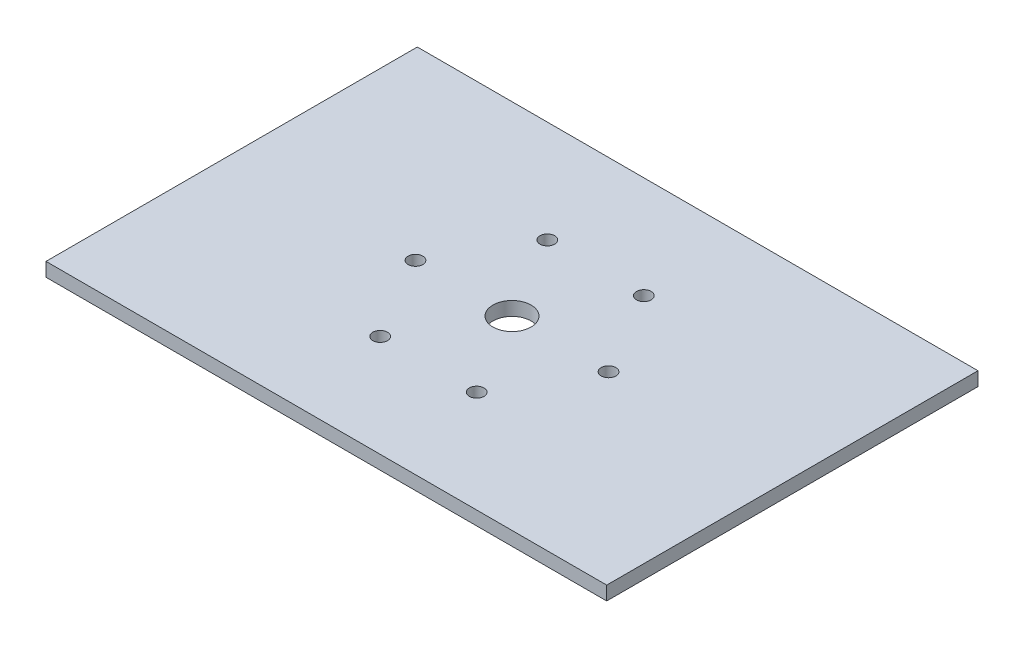
ISO-10303-21;
HEADER;
FILE_DESCRIPTION(('STEP AP214'),'2;1');
FILE_NAME('part.step','',(''),(''),'','','');
FILE_SCHEMA(('AUTOMOTIVE_DESIGN { 1 0 10303 214 1 1 1 1 }'));
ENDSEC;
DATA;
#1=APPLICATION_CONTEXT('core data for automotive mechanical design processes');
#2=APPLICATION_PROTOCOL_DEFINITION('international standard','automotive_design',2000,#1);
#3=PRODUCT_CONTEXT('',#1,'mechanical');
#4=PRODUCT('Part','Part','',(#3));
#5=PRODUCT_RELATED_PRODUCT_CATEGORY('part','',(#4));
#6=PRODUCT_DEFINITION_FORMATION('','',#4);
#7=PRODUCT_DEFINITION_CONTEXT('part definition',#1,'design');
#8=PRODUCT_DEFINITION('design','',#6,#7);
#9=PRODUCT_DEFINITION_SHAPE('','',#8);
#10=(LENGTH_UNIT() NAMED_UNIT(*) SI_UNIT(.MILLI.,.METRE.));
#11=(NAMED_UNIT(*) PLANE_ANGLE_UNIT() SI_UNIT($,.RADIAN.));
#12=(NAMED_UNIT(*) SI_UNIT($,.STERADIAN.) SOLID_ANGLE_UNIT());
#13=UNCERTAINTY_MEASURE_WITH_UNIT(LENGTH_MEASURE(1.E-05),#10,'distance_accuracy_value','');
#14=(GEOMETRIC_REPRESENTATION_CONTEXT(3) GLOBAL_UNCERTAINTY_ASSIGNED_CONTEXT((#13)) GLOBAL_UNIT_ASSIGNED_CONTEXT((#10,
#11,#12)) REPRESENTATION_CONTEXT('',''));
#15=CARTESIAN_POINT('',(0.,0.,0.));
#16=DIRECTION('',(0.,0.,1.));
#17=DIRECTION('',(1.,0.,0.));
#18=AXIS2_PLACEMENT_3D('',#15,#16,#17);
#19=CARTESIAN_POINT('',(0.,3.,0.));
#20=DIRECTION('',(0.,-1.,0.));
#21=DIRECTION('',(0.,0.,-1.));
#22=AXIS2_PLACEMENT_3D('',#19,#20,#21);
#23=PLANE('',#22);
#24=DIRECTION('',(0.,0.,1.));
#25=VECTOR('',#24,1.);
#26=CARTESIAN_POINT('',(0.,3.,0.));
#27=LINE('',#26,#25);
#28=CARTESIAN_POINT('',(0.,3.,-80.79));
#29=VERTEX_POINT('',#28);
#30=CARTESIAN_POINT('',(0.,3.,0.));
#31=VERTEX_POINT('',#30);
#32=EDGE_CURVE('E94',#29,#31,#27,.T.);
#33=ORIENTED_EDGE('',*,*,#32,.T.);
#34=DIRECTION('',(1.,0.,0.));
#35=VECTOR('',#34,1.);
#36=CARTESIAN_POINT('',(0.,3.,0.));
#37=LINE('',#36,#35);
#38=CARTESIAN_POINT('',(122.,3.,0.));
#39=VERTEX_POINT('',#38);
#40=EDGE_CURVE('E89',#31,#39,#37,.T.);
#41=ORIENTED_EDGE('',*,*,#40,.T.);
#42=DIRECTION('',(0.,0.,-1.));
#43=VECTOR('',#42,1.);
#44=CARTESIAN_POINT('',(122.,3.,0.));
#45=LINE('',#44,#43);
#46=CARTESIAN_POINT('',(122.,3.,-80.79));
#47=VERTEX_POINT('',#46);
#48=EDGE_CURVE('E92',#39,#47,#45,.T.);
#49=ORIENTED_EDGE('',*,*,#48,.T.);
#50=DIRECTION('',(-1.,0.,0.));
#51=VECTOR('',#50,1.);
#52=CARTESIAN_POINT('',(0.,3.,-80.79));
#53=LINE('',#52,#51);
#54=EDGE_CURVE('E59',#47,#29,#53,.T.);
#55=ORIENTED_EDGE('',*,*,#54,.T.);
#56=EDGE_LOOP('',(#33,#41,#49,#55));
#57=FACE_BOUND('',#56,.T.);
#58=CARTESIAN_POINT('',(40.,3.,-40.395));
#59=DIRECTION('',(0.,1.,0.));
#60=DIRECTION('',(0.,0.,1.));
#61=AXIS2_PLACEMENT_3D('',#58,#59,#60);
#62=CIRCLE('',#61,1.6);
#63=CARTESIAN_POINT('',(40.,3.,-38.795));
#64=VERTEX_POINT('',#63);
#65=EDGE_CURVE('E109',#64,#64,#62,.T.);
#66=ORIENTED_EDGE('',*,*,#65,.F.);
#67=EDGE_LOOP('',(#66));
#68=FACE_BOUND('',#67,.T.);
#69=CARTESIAN_POINT('',(61.,3.,-40.395));
#70=DIRECTION('',(0.,1.,0.));
#71=DIRECTION('',(0.,0.,1.));
#72=AXIS2_PLACEMENT_3D('',#69,#70,#71);
#73=CIRCLE('',#72,4.15);
#74=CARTESIAN_POINT('',(61.,3.,-36.245));
#75=VERTEX_POINT('',#74);
#76=EDGE_CURVE('E124',#75,#75,#73,.T.);
#77=ORIENTED_EDGE('',*,*,#76,.F.);
#78=EDGE_LOOP('',(#77));
#79=FACE_BOUND('',#78,.T.);
#80=CARTESIAN_POINT('',(50.5000000000003,3.,-58.5815334794734));
#81=DIRECTION('',(0.,1.,0.));
#82=DIRECTION('',(0.,0.,1.));
#83=AXIS2_PLACEMENT_3D('',#80,#81,#82);
#84=CIRCLE('',#83,1.60000000000002);
#85=CARTESIAN_POINT('',(50.5000000000003,3.,-56.9815334794734));
#86=VERTEX_POINT('',#85);
#87=EDGE_CURVE('E130',#86,#86,#84,.T.);
#88=ORIENTED_EDGE('',*,*,#87,.F.);
#89=EDGE_LOOP('',(#88));
#90=FACE_BOUND('',#89,.T.);
#91=CARTESIAN_POINT('',(71.5000000000003,3.,-58.5815334794731));
#92=DIRECTION('',(0.,1.,0.));
#93=DIRECTION('',(0.,0.,1.));
#94=AXIS2_PLACEMENT_3D('',#91,#92,#93);
#95=CIRCLE('',#94,1.59999999999999);
#96=CARTESIAN_POINT('',(71.5000000000003,3.,-56.9815334794731));
#97=VERTEX_POINT('',#96);
#98=EDGE_CURVE('E136',#97,#97,#95,.T.);
#99=ORIENTED_EDGE('',*,*,#98,.F.);
#100=EDGE_LOOP('',(#99));
#101=FACE_BOUND('',#100,.T.);
#102=CARTESIAN_POINT('',(82.,3.,-40.3949999999999));
#103=DIRECTION('',(0.,1.,0.));
#104=DIRECTION('',(0.,0.,1.));
#105=AXIS2_PLACEMENT_3D('',#102,#103,#104);
#106=CIRCLE('',#105,1.6);
#107=CARTESIAN_POINT('',(82.,3.,-38.7949999999999));
#108=VERTEX_POINT('',#107);
#109=EDGE_CURVE('E142',#108,#108,#106,.T.);
#110=ORIENTED_EDGE('',*,*,#109,.F.);
#111=EDGE_LOOP('',(#110));
#112=FACE_BOUND('',#111,.T.);
#113=CARTESIAN_POINT('',(71.4999999999998,3.,-22.2084665205267));
#114=DIRECTION('',(0.,1.,0.));
#115=DIRECTION('',(0.,0.,1.));
#116=AXIS2_PLACEMENT_3D('',#113,#114,#115);
#117=CIRCLE('',#116,1.6);
#118=CARTESIAN_POINT('',(71.4999999999998,3.,-20.6084665205267));
#119=VERTEX_POINT('',#118);
#120=EDGE_CURVE('E148',#119,#119,#117,.T.);
#121=ORIENTED_EDGE('',*,*,#120,.F.);
#122=EDGE_LOOP('',(#121));
#123=FACE_BOUND('',#122,.T.);
#124=CARTESIAN_POINT('',(50.4999999999998,3.,-22.2084665205269));
#125=DIRECTION('',(0.,1.,0.));
#126=DIRECTION('',(0.,0.,1.));
#127=AXIS2_PLACEMENT_3D('',#124,#125,#126);
#128=CIRCLE('',#127,1.6);
#129=CARTESIAN_POINT('',(50.4999999999998,3.,-20.6084665205269));
#130=VERTEX_POINT('',#129);
#131=EDGE_CURVE('E154',#130,#130,#128,.T.);
#132=ORIENTED_EDGE('',*,*,#131,.F.);
#133=EDGE_LOOP('',(#132));
#134=FACE_BOUND('',#133,.T.);
#135=ADVANCED_FACE('F42',(#57,#68,#79,#90,#101,#112,#123,#134),#23,.F.);
#136=CARTESIAN_POINT('',(0.,0.,0.));
#137=DIRECTION('',(0.,-1.,0.));
#138=DIRECTION('',(0.,0.,-1.));
#139=AXIS2_PLACEMENT_3D('',#136,#137,#138);
#140=PLANE('',#139);
#141=CARTESIAN_POINT('',(71.4999999999998,0.,-22.2084665205267));
#142=DIRECTION('',(0.,1.,0.));
#143=DIRECTION('',(0.,0.,1.));
#144=AXIS2_PLACEMENT_3D('',#141,#142,#143);
#145=CIRCLE('',#144,1.6);
#146=CARTESIAN_POINT('',(71.4999999999998,0.,-20.6084665205267));
#147=VERTEX_POINT('',#146);
#148=EDGE_CURVE('E151',#147,#147,#145,.T.);
#149=ORIENTED_EDGE('',*,*,#148,.T.);
#150=EDGE_LOOP('',(#149));
#151=FACE_BOUND('',#150,.T.);
#152=CARTESIAN_POINT('',(71.5000000000003,0.,-58.5815334794731));
#153=DIRECTION('',(0.,1.,0.));
#154=DIRECTION('',(0.,0.,1.));
#155=AXIS2_PLACEMENT_3D('',#152,#153,#154);
#156=CIRCLE('',#155,1.59999999999999);
#157=CARTESIAN_POINT('',(71.5000000000003,0.,-56.9815334794731));
#158=VERTEX_POINT('',#157);
#159=EDGE_CURVE('E139',#158,#158,#156,.T.);
#160=ORIENTED_EDGE('',*,*,#159,.T.);
#161=EDGE_LOOP('',(#160));
#162=FACE_BOUND('',#161,.T.);
#163=CARTESIAN_POINT('',(61.,0.,-40.395));
#164=DIRECTION('',(0.,1.,0.));
#165=DIRECTION('',(0.,0.,1.));
#166=AXIS2_PLACEMENT_3D('',#163,#164,#165);
#167=CIRCLE('',#166,4.15);
#168=CARTESIAN_POINT('',(61.,0.,-36.245));
#169=VERTEX_POINT('',#168);
#170=EDGE_CURVE('E127',#169,#169,#167,.T.);
#171=ORIENTED_EDGE('',*,*,#170,.T.);
#172=EDGE_LOOP('',(#171));
#173=FACE_BOUND('',#172,.T.);
#174=DIRECTION('',(0.,0.,1.));
#175=VECTOR('',#174,1.);
#176=CARTESIAN_POINT('',(0.,0.,0.));
#177=LINE('',#176,#175);
#178=CARTESIAN_POINT('',(0.,0.,-80.79));
#179=VERTEX_POINT('',#178);
#180=CARTESIAN_POINT('',(0.,0.,0.));
#181=VERTEX_POINT('',#180);
#182=EDGE_CURVE('E106',#179,#181,#177,.T.);
#183=ORIENTED_EDGE('',*,*,#182,.F.);
#184=DIRECTION('',(-1.,0.,0.));
#185=VECTOR('',#184,1.);
#186=CARTESIAN_POINT('',(0.,0.,-80.79));
#187=LINE('',#186,#185);
#188=CARTESIAN_POINT('',(122.,0.,-80.79));
#189=VERTEX_POINT('',#188);
#190=EDGE_CURVE('E82',#189,#179,#187,.T.);
#191=ORIENTED_EDGE('',*,*,#190,.F.);
#192=DIRECTION('',(0.,0.,-1.));
#193=VECTOR('',#192,1.);
#194=CARTESIAN_POINT('',(122.,0.,0.));
#195=LINE('',#194,#193);
#196=CARTESIAN_POINT('',(122.,0.,0.));
#197=VERTEX_POINT('',#196);
#198=EDGE_CURVE('E76',#197,#189,#195,.T.);
#199=ORIENTED_EDGE('',*,*,#198,.F.);
#200=DIRECTION('',(1.,0.,0.));
#201=VECTOR('',#200,1.);
#202=CARTESIAN_POINT('',(0.,0.,0.));
#203=LINE('',#202,#201);
#204=EDGE_CURVE('E98',#181,#197,#203,.T.);
#205=ORIENTED_EDGE('',*,*,#204,.F.);
#206=EDGE_LOOP('',(#183,#191,#199,#205));
#207=FACE_BOUND('',#206,.T.);
#208=CARTESIAN_POINT('',(40.,0.,-40.395));
#209=DIRECTION('',(0.,1.,0.));
#210=DIRECTION('',(0.,0.,1.));
#211=AXIS2_PLACEMENT_3D('',#208,#209,#210);
#212=CIRCLE('',#211,1.6);
#213=CARTESIAN_POINT('',(40.,0.,-38.795));
#214=VERTEX_POINT('',#213);
#215=EDGE_CURVE('E121',#214,#214,#212,.T.);
#216=ORIENTED_EDGE('',*,*,#215,.T.);
#217=EDGE_LOOP('',(#216));
#218=FACE_BOUND('',#217,.T.);
#219=CARTESIAN_POINT('',(50.5000000000003,0.,-58.5815334794734));
#220=DIRECTION('',(0.,1.,0.));
#221=DIRECTION('',(0.,0.,1.));
#222=AXIS2_PLACEMENT_3D('',#219,#220,#221);
#223=CIRCLE('',#222,1.60000000000002);
#224=CARTESIAN_POINT('',(50.5000000000003,0.,-56.9815334794734));
#225=VERTEX_POINT('',#224);
#226=EDGE_CURVE('E133',#225,#225,#223,.T.);
#227=ORIENTED_EDGE('',*,*,#226,.T.);
#228=EDGE_LOOP('',(#227));
#229=FACE_BOUND('',#228,.T.);
#230=CARTESIAN_POINT('',(82.,0.,-40.3949999999999));
#231=DIRECTION('',(0.,1.,0.));
#232=DIRECTION('',(0.,0.,1.));
#233=AXIS2_PLACEMENT_3D('',#230,#231,#232);
#234=CIRCLE('',#233,1.6);
#235=CARTESIAN_POINT('',(82.,0.,-38.7949999999999));
#236=VERTEX_POINT('',#235);
#237=EDGE_CURVE('E145',#236,#236,#234,.T.);
#238=ORIENTED_EDGE('',*,*,#237,.T.);
#239=EDGE_LOOP('',(#238));
#240=FACE_BOUND('',#239,.T.);
#241=CARTESIAN_POINT('',(50.4999999999998,0.,-22.2084665205269));
#242=DIRECTION('',(0.,1.,0.));
#243=DIRECTION('',(0.,0.,1.));
#244=AXIS2_PLACEMENT_3D('',#241,#242,#243);
#245=CIRCLE('',#244,1.6);
#246=CARTESIAN_POINT('',(50.4999999999998,0.,-20.6084665205269));
#247=VERTEX_POINT('',#246);
#248=EDGE_CURVE('E157',#247,#247,#245,.T.);
#249=ORIENTED_EDGE('',*,*,#248,.T.);
#250=EDGE_LOOP('',(#249));
#251=FACE_BOUND('',#250,.T.);
#252=ADVANCED_FACE('F117',(#151,#162,#173,#207,#218,#229,#240,#251),#140,.T.);
#253=CARTESIAN_POINT('',(0.,3.,0.));
#254=DIRECTION('',(1.,0.,0.));
#255=DIRECTION('',(0.,0.,-1.));
#256=AXIS2_PLACEMENT_3D('',#253,#254,#255);
#257=PLANE('',#256);
#258=ORIENTED_EDGE('',*,*,#182,.T.);
#259=DIRECTION('',(0.,-1.,0.));
#260=VECTOR('',#259,1.);
#261=CARTESIAN_POINT('',(0.,3.,0.));
#262=LINE('',#261,#260);
#263=EDGE_CURVE('E11',#31,#181,#262,.T.);
#264=ORIENTED_EDGE('',*,*,#263,.F.);
#265=ORIENTED_EDGE('',*,*,#32,.F.);
#266=DIRECTION('',(0.,-1.,0.));
#267=VECTOR('',#266,1.);
#268=CARTESIAN_POINT('',(0.,3.,-80.79));
#269=LINE('',#268,#267);
#270=EDGE_CURVE('E102',#29,#179,#269,.T.);
#271=ORIENTED_EDGE('',*,*,#270,.T.);
#272=EDGE_LOOP('',(#258,#264,#265,#271));
#273=FACE_BOUND('',#272,.T.);
#274=ADVANCED_FACE('F44',(#273),#257,.F.);
#275=CARTESIAN_POINT('',(0.,3.,0.));
#276=DIRECTION('',(0.,0.,-1.));
#277=DIRECTION('',(-1.,0.,0.));
#278=AXIS2_PLACEMENT_3D('',#275,#276,#277);
#279=PLANE('',#278);
#280=ORIENTED_EDGE('',*,*,#204,.T.);
#281=DIRECTION('',(0.,-1.,0.));
#282=VECTOR('',#281,1.);
#283=CARTESIAN_POINT('',(122.,3.,0.));
#284=LINE('',#283,#282);
#285=EDGE_CURVE('E51',#39,#197,#284,.T.);
#286=ORIENTED_EDGE('',*,*,#285,.F.);
#287=ORIENTED_EDGE('',*,*,#40,.F.);
#288=ORIENTED_EDGE('',*,*,#263,.T.);
#289=EDGE_LOOP('',(#280,#286,#287,#288));
#290=FACE_BOUND('',#289,.T.);
#291=ADVANCED_FACE('F97',(#290),#279,.F.);
#292=CARTESIAN_POINT('',(122.,3.,0.));
#293=DIRECTION('',(-1.,0.,0.));
#294=DIRECTION('',(0.,0.,1.));
#295=AXIS2_PLACEMENT_3D('',#292,#293,#294);
#296=PLANE('',#295);
#297=ORIENTED_EDGE('',*,*,#198,.T.);
#298=DIRECTION('',(0.,-1.,0.));
#299=VECTOR('',#298,1.);
#300=CARTESIAN_POINT('',(122.,3.,-80.79));
#301=LINE('',#300,#299);
#302=EDGE_CURVE('E99',#47,#189,#301,.T.);
#303=ORIENTED_EDGE('',*,*,#302,.F.);
#304=ORIENTED_EDGE('',*,*,#48,.F.);
#305=ORIENTED_EDGE('',*,*,#285,.T.);
#306=EDGE_LOOP('',(#297,#303,#304,#305));
#307=FACE_BOUND('',#306,.T.);
#308=ADVANCED_FACE('F100',(#307),#296,.F.);
#309=CARTESIAN_POINT('',(0.,3.,-80.79));
#310=DIRECTION('',(0.,0.,1.));
#311=DIRECTION('',(1.,0.,0.));
#312=AXIS2_PLACEMENT_3D('',#309,#310,#311);
#313=PLANE('',#312);
#314=ORIENTED_EDGE('',*,*,#190,.T.);
#315=ORIENTED_EDGE('',*,*,#270,.F.);
#316=ORIENTED_EDGE('',*,*,#54,.F.);
#317=ORIENTED_EDGE('',*,*,#302,.T.);
#318=EDGE_LOOP('',(#314,#315,#316,#317));
#319=FACE_BOUND('',#318,.T.);
#320=ADVANCED_FACE('F114',(#319),#313,.F.);
#321=CARTESIAN_POINT('',(40.,3.,-40.395));
#322=DIRECTION('',(0.,-1.,0.));
#323=DIRECTION('',(0.,0.,-1.));
#324=AXIS2_PLACEMENT_3D('',#321,#322,#323);
#325=CYLINDRICAL_SURFACE('',#324,1.6);
#326=ORIENTED_EDGE('',*,*,#65,.T.);
#327=EDGE_LOOP('',(#326));
#328=FACE_BOUND('',#327,.T.);
#329=ORIENTED_EDGE('',*,*,#215,.F.);
#330=EDGE_LOOP('',(#329));
#331=FACE_BOUND('',#330,.T.);
#332=ADVANCED_FACE('F174',(#328,#331),#325,.F.);
#333=CARTESIAN_POINT('',(61.,3.,-40.395));
#334=DIRECTION('',(0.,-1.,0.));
#335=DIRECTION('',(0.,0.,-1.));
#336=AXIS2_PLACEMENT_3D('',#333,#334,#335);
#337=CYLINDRICAL_SURFACE('',#336,4.15);
#338=ORIENTED_EDGE('',*,*,#76,.T.);
#339=EDGE_LOOP('',(#338));
#340=FACE_BOUND('',#339,.T.);
#341=ORIENTED_EDGE('',*,*,#170,.F.);
#342=EDGE_LOOP('',(#341));
#343=FACE_BOUND('',#342,.T.);
#344=ADVANCED_FACE('F219',(#340,#343),#337,.F.);
#345=CARTESIAN_POINT('',(50.5000000000003,3.,-58.5815334794734));
#346=DIRECTION('',(0.,-1.,0.));
#347=DIRECTION('',(0.,0.,-1.));
#348=AXIS2_PLACEMENT_3D('',#345,#346,#347);
#349=CYLINDRICAL_SURFACE('',#348,1.60000000000002);
#350=ORIENTED_EDGE('',*,*,#87,.T.);
#351=EDGE_LOOP('',(#350));
#352=FACE_BOUND('',#351,.T.);
#353=ORIENTED_EDGE('',*,*,#226,.F.);
#354=EDGE_LOOP('',(#353));
#355=FACE_BOUND('',#354,.T.);
#356=ADVANCED_FACE('F227',(#352,#355),#349,.F.);
#357=CARTESIAN_POINT('',(71.5000000000003,3.,-58.5815334794731));
#358=DIRECTION('',(0.,-1.,0.));
#359=DIRECTION('',(0.,0.,-1.));
#360=AXIS2_PLACEMENT_3D('',#357,#358,#359);
#361=CYLINDRICAL_SURFACE('',#360,1.59999999999999);
#362=ORIENTED_EDGE('',*,*,#98,.T.);
#363=EDGE_LOOP('',(#362));
#364=FACE_BOUND('',#363,.T.);
#365=ORIENTED_EDGE('',*,*,#159,.F.);
#366=EDGE_LOOP('',(#365));
#367=FACE_BOUND('',#366,.T.);
#368=ADVANCED_FACE('F235',(#364,#367),#361,.F.);
#369=CARTESIAN_POINT('',(82.,3.,-40.3949999999999));
#370=DIRECTION('',(0.,-1.,0.));
#371=DIRECTION('',(0.,0.,-1.));
#372=AXIS2_PLACEMENT_3D('',#369,#370,#371);
#373=CYLINDRICAL_SURFACE('',#372,1.6);
#374=ORIENTED_EDGE('',*,*,#109,.T.);
#375=EDGE_LOOP('',(#374));
#376=FACE_BOUND('',#375,.T.);
#377=ORIENTED_EDGE('',*,*,#237,.F.);
#378=EDGE_LOOP('',(#377));
#379=FACE_BOUND('',#378,.T.);
#380=ADVANCED_FACE('F244',(#376,#379),#373,.F.);
#381=CARTESIAN_POINT('',(71.4999999999998,3.,-22.2084665205267));
#382=DIRECTION('',(0.,-1.,0.));
#383=DIRECTION('',(0.,0.,-1.));
#384=AXIS2_PLACEMENT_3D('',#381,#382,#383);
#385=CYLINDRICAL_SURFACE('',#384,1.6);
#386=ORIENTED_EDGE('',*,*,#120,.T.);
#387=EDGE_LOOP('',(#386));
#388=FACE_BOUND('',#387,.T.);
#389=ORIENTED_EDGE('',*,*,#148,.F.);
#390=EDGE_LOOP('',(#389));
#391=FACE_BOUND('',#390,.T.);
#392=ADVANCED_FACE('F253',(#388,#391),#385,.F.);
#393=CARTESIAN_POINT('',(50.4999999999998,3.,-22.2084665205269));
#394=DIRECTION('',(0.,-1.,0.));
#395=DIRECTION('',(0.,0.,-1.));
#396=AXIS2_PLACEMENT_3D('',#393,#394,#395);
#397=CYLINDRICAL_SURFACE('',#396,1.6);
#398=ORIENTED_EDGE('',*,*,#131,.T.);
#399=EDGE_LOOP('',(#398));
#400=FACE_BOUND('',#399,.T.);
#401=ORIENTED_EDGE('',*,*,#248,.F.);
#402=EDGE_LOOP('',(#401));
#403=FACE_BOUND('',#402,.T.);
#404=ADVANCED_FACE('F163',(#400,#403),#397,.F.);
#405=CLOSED_SHELL('',(#135,#252,#274,#291,#308,#320,#332,#344,#356,#368,#380,#392,#404));
#406=MANIFOLD_SOLID_BREP('B2',#405);
#407=ADVANCED_BREP_SHAPE_REPRESENTATION('',(#18,#406),#14);
#408=SHAPE_DEFINITION_REPRESENTATION(#9,#407);
ENDSEC;
END-ISO-10303-21;
